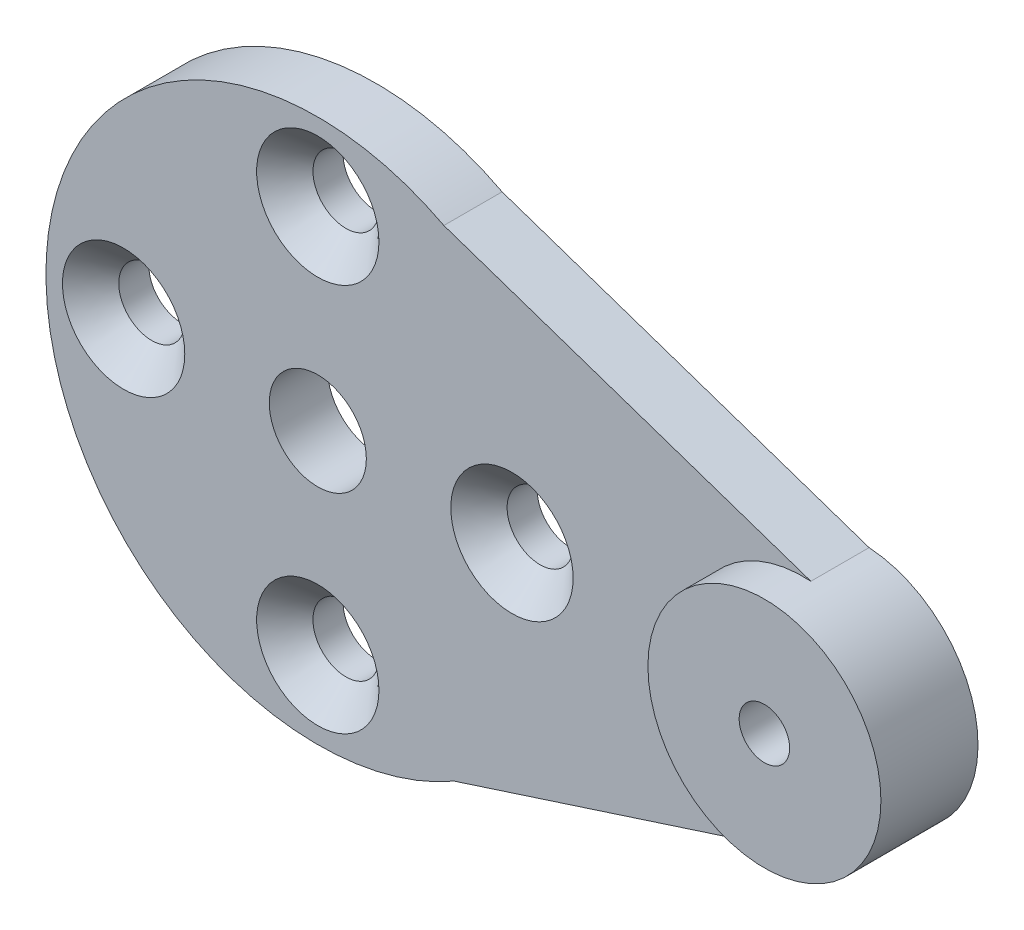
ISO-10303-21;
HEADER;
FILE_DESCRIPTION(('STEP AP214'),'2;1');
FILE_NAME('part.step','',(''),(''),'','','');
FILE_SCHEMA(('AUTOMOTIVE_DESIGN { 1 0 10303 214 1 1 1 1 }'));
ENDSEC;
DATA;
#1=APPLICATION_CONTEXT('core data for automotive mechanical design processes');
#2=APPLICATION_PROTOCOL_DEFINITION('international standard','automotive_design',2000,#1);
#3=PRODUCT_CONTEXT('',#1,'mechanical');
#4=PRODUCT('Part','Part','',(#3));
#5=PRODUCT_RELATED_PRODUCT_CATEGORY('part','',(#4));
#6=PRODUCT_DEFINITION_FORMATION('','',#4);
#7=PRODUCT_DEFINITION_CONTEXT('part definition',#1,'design');
#8=PRODUCT_DEFINITION('design','',#6,#7);
#9=PRODUCT_DEFINITION_SHAPE('','',#8);
#10=(LENGTH_UNIT() NAMED_UNIT(*) SI_UNIT(.MILLI.,.METRE.));
#11=(NAMED_UNIT(*) PLANE_ANGLE_UNIT() SI_UNIT($,.RADIAN.));
#12=(NAMED_UNIT(*) SI_UNIT($,.STERADIAN.) SOLID_ANGLE_UNIT());
#13=UNCERTAINTY_MEASURE_WITH_UNIT(LENGTH_MEASURE(1.E-05),#10,'distance_accuracy_value','');
#14=(GEOMETRIC_REPRESENTATION_CONTEXT(3) GLOBAL_UNCERTAINTY_ASSIGNED_CONTEXT((#13)) GLOBAL_UNIT_ASSIGNED_CONTEXT((#10,
#11,#12)) REPRESENTATION_CONTEXT('',''));
#15=CARTESIAN_POINT('',(0.,0.,0.));
#16=DIRECTION('',(0.,0.,1.));
#17=DIRECTION('',(1.,0.,0.));
#18=AXIS2_PLACEMENT_3D('',#15,#16,#17);
#19=CARTESIAN_POINT('',(25.,0.,3.));
#20=DIRECTION('',(0.,0.,-1.));
#21=DIRECTION('',(-1.,0.,0.));
#22=AXIS2_PLACEMENT_3D('',#19,#20,#21);
#23=CYLINDRICAL_SURFACE('',#22,6.);
#24=CARTESIAN_POINT('',(25.,0.,0.));
#25=DIRECTION('',(0.,0.,1.));
#26=DIRECTION('',(1.,0.,0.));
#27=AXIS2_PLACEMENT_3D('',#24,#25,#26);
#28=CIRCLE('',#27,6.);
#29=CARTESIAN_POINT('',(26.5781101997848,-5.78874495873979,0.));
#30=VERTEX_POINT('',#29);
#31=CARTESIAN_POINT('',(25.3934245126557,5.98708753509097,0.));
#32=VERTEX_POINT('',#31);
#33=EDGE_CURVE('E100',#30,#32,#28,.T.);
#34=ORIENTED_EDGE('',*,*,#33,.T.);
#35=DIRECTION('',(0.,0.,-1.));
#36=VECTOR('',#35,1.);
#37=CARTESIAN_POINT('',(25.3934245126557,5.98708753509097,3.));
#38=LINE('',#37,#36);
#39=CARTESIAN_POINT('',(25.3934245126557,5.98708753509097,3.));
#40=VERTEX_POINT('',#39);
#41=EDGE_CURVE('E11',#40,#32,#38,.T.);
#42=ORIENTED_EDGE('',*,*,#41,.F.);
#43=CARTESIAN_POINT('',(25.,0.,3.));
#44=DIRECTION('',(0.,0.,1.));
#45=DIRECTION('',(1.,0.,0.));
#46=AXIS2_PLACEMENT_3D('',#43,#44,#45);
#47=CIRCLE('',#46,6.);
#48=CARTESIAN_POINT('',(26.5781101997848,-5.78874495873979,3.));
#49=VERTEX_POINT('',#48);
#50=EDGE_CURVE('E98',#40,#49,#47,.T.);
#51=ORIENTED_EDGE('',*,*,#50,.T.);
#52=DIRECTION('',(0.,0.,-1.));
#53=VECTOR('',#52,1.);
#54=CARTESIAN_POINT('',(26.5781101997848,-5.78874495873979,3.));
#55=LINE('',#54,#53);
#56=EDGE_CURVE('E126',#49,#30,#55,.T.);
#57=ORIENTED_EDGE('',*,*,#56,.T.);
#58=EDGE_LOOP('',(#34,#42,#51,#57));
#59=FACE_BOUND('',#58,.T.);
#60=CARTESIAN_POINT('',(25.,0.,5.));
#61=DIRECTION('',(0.,0.,1.));
#62=DIRECTION('',(1.,0.,0.));
#63=AXIS2_PLACEMENT_3D('',#60,#61,#62);
#64=CIRCLE('',#63,6.);
#65=CARTESIAN_POINT('',(31.,0.,5.));
#66=VERTEX_POINT('',#65);
#67=EDGE_CURVE('E109',#66,#66,#64,.T.);
#68=ORIENTED_EDGE('',*,*,#67,.F.);
#69=EDGE_LOOP('',(#68));
#70=FACE_BOUND('',#69,.T.);
#71=ADVANCED_FACE('F44',(#59,#70),#23,.T.);
#72=CARTESIAN_POINT('',(6.49207546770946,12.4037476643781,3.));
#73=DIRECTION('',(-0.321462676210907,-0.946922250136368,0.));
#74=DIRECTION('',(0.946922250136368,-0.321462676210907,0.));
#75=AXIS2_PLACEMENT_3D('',#72,#73,#74);
#76=PLANE('',#75);
#77=DIRECTION('',(-0.946922250136368,0.321462676210907,0.));
#78=VECTOR('',#77,1.);
#79=CARTESIAN_POINT('',(6.49207546770946,12.4037476643781,0.));
#80=LINE('',#79,#78);
#81=CARTESIAN_POINT('',(6.49207546770946,12.4037476643781,0.));
#82=VERTEX_POINT('',#81);
#83=EDGE_CURVE('E129',#32,#82,#80,.T.);
#84=ORIENTED_EDGE('',*,*,#83,.T.);
#85=DIRECTION('',(0.,0.,-1.));
#86=VECTOR('',#85,1.);
#87=CARTESIAN_POINT('',(6.49207546770946,12.4037476643781,3.));
#88=LINE('',#87,#86);
#89=CARTESIAN_POINT('',(6.49207546770946,12.4037476643781,3.));
#90=VERTEX_POINT('',#89);
#91=EDGE_CURVE('E54',#90,#82,#88,.T.);
#92=ORIENTED_EDGE('',*,*,#91,.F.);
#93=DIRECTION('',(-0.946922250136368,0.321462676210907,0.));
#94=VECTOR('',#93,1.);
#95=CARTESIAN_POINT('',(6.49207546770946,12.4037476643781,3.));
#96=LINE('',#95,#94);
#97=EDGE_CURVE('E90',#40,#90,#96,.T.);
#98=ORIENTED_EDGE('',*,*,#97,.F.);
#99=ORIENTED_EDGE('',*,*,#41,.T.);
#100=EDGE_LOOP('',(#84,#92,#98,#99));
#101=FACE_BOUND('',#100,.T.);
#102=ADVANCED_FACE('F102',(#101),#76,.F.);
#103=CARTESIAN_POINT('',(0.,0.,3.));
#104=DIRECTION('',(0.,0.,-1.));
#105=DIRECTION('',(-1.,0.,0.));
#106=AXIS2_PLACEMENT_3D('',#103,#104,#105);
#107=CYLINDRICAL_SURFACE('',#106,14.);
#108=CARTESIAN_POINT('',(0.,0.,0.));
#109=DIRECTION('',(0.,0.,1.));
#110=DIRECTION('',(1.,0.,0.));
#111=AXIS2_PLACEMENT_3D('',#108,#109,#110);
#112=CIRCLE('',#111,14.);
#113=CARTESIAN_POINT('',(7.02294786428424,-12.1110777099127,0.));
#114=VERTEX_POINT('',#113);
#115=EDGE_CURVE('E81',#82,#114,#112,.T.);
#116=ORIENTED_EDGE('',*,*,#115,.T.);
#117=DIRECTION('',(0.,0.,-1.));
#118=VECTOR('',#117,1.);
#119=CARTESIAN_POINT('',(7.02294786428424,-12.1110777099127,3.));
#120=LINE('',#119,#118);
#121=CARTESIAN_POINT('',(7.02294786428424,-12.1110777099127,3.));
#122=VERTEX_POINT('',#121);
#123=EDGE_CURVE('E138',#122,#114,#120,.T.);
#124=ORIENTED_EDGE('',*,*,#123,.F.);
#125=CARTESIAN_POINT('',(0.,0.,3.));
#126=DIRECTION('',(0.,0.,1.));
#127=DIRECTION('',(1.,0.,0.));
#128=AXIS2_PLACEMENT_3D('',#125,#126,#127);
#129=CIRCLE('',#128,14.);
#130=EDGE_CURVE('E105',#90,#122,#129,.T.);
#131=ORIENTED_EDGE('',*,*,#130,.F.);
#132=ORIENTED_EDGE('',*,*,#91,.T.);
#133=EDGE_LOOP('',(#116,#124,#131,#132));
#134=FACE_BOUND('',#133,.T.);
#135=ADVANCED_FACE('F213',(#134),#107,.T.);
#136=CARTESIAN_POINT('',(7.02294786428424,-12.1110777099127,3.));
#137=DIRECTION('',(-0.307629228664029,0.951506309843279,0.));
#138=DIRECTION('',(-0.951506309843279,-0.307629228664029,0.));
#139=AXIS2_PLACEMENT_3D('',#136,#137,#138);
#140=PLANE('',#139);
#141=DIRECTION('',(0.951506309843279,0.307629228664029,0.));
#142=VECTOR('',#141,1.);
#143=CARTESIAN_POINT('',(7.02294786428424,-12.1110777099127,0.));
#144=LINE('',#143,#142);
#145=EDGE_CURVE('E86',#114,#30,#144,.T.);
#146=ORIENTED_EDGE('',*,*,#145,.T.);
#147=ORIENTED_EDGE('',*,*,#56,.F.);
#148=DIRECTION('',(0.951506309843279,0.307629228664029,0.));
#149=VECTOR('',#148,1.);
#150=CARTESIAN_POINT('',(7.02294786428424,-12.1110777099127,3.));
#151=LINE('',#150,#149);
#152=EDGE_CURVE('E63',#122,#49,#151,.T.);
#153=ORIENTED_EDGE('',*,*,#152,.F.);
#154=ORIENTED_EDGE('',*,*,#123,.T.);
#155=EDGE_LOOP('',(#146,#147,#153,#154));
#156=FACE_BOUND('',#155,.T.);
#157=ADVANCED_FACE('F217',(#156),#140,.F.);
#158=CARTESIAN_POINT('',(25.,0.,3.));
#159=DIRECTION('',(0.,0.,1.));
#160=DIRECTION('',(1.,0.,0.));
#161=AXIS2_PLACEMENT_3D('',#158,#159,#160);
#162=PLANE('',#161);
#163=CARTESIAN_POINT('',(0.,10.,3.));
#164=DIRECTION('',(0.,0.,1.));
#165=DIRECTION('',(1.,0.,0.));
#166=AXIS2_PLACEMENT_3D('',#163,#164,#165);
#167=CIRCLE('',#166,3.15);
#168=CARTESIAN_POINT('',(3.15,10.,3.));
#169=VERTEX_POINT('',#168);
#170=EDGE_CURVE('E273',#169,#169,#167,.T.);
#171=ORIENTED_EDGE('',*,*,#170,.F.);
#172=EDGE_LOOP('',(#171));
#173=FACE_BOUND('',#172,.T.);
#174=CARTESIAN_POINT('',(-10.,0.,3.));
#175=DIRECTION('',(0.,0.,1.));
#176=DIRECTION('',(1.,0.,0.));
#177=AXIS2_PLACEMENT_3D('',#174,#175,#176);
#178=CIRCLE('',#177,3.15);
#179=CARTESIAN_POINT('',(-6.85,0.,3.));
#180=VERTEX_POINT('',#179);
#181=EDGE_CURVE('E168',#180,#180,#178,.T.);
#182=ORIENTED_EDGE('',*,*,#181,.F.);
#183=EDGE_LOOP('',(#182));
#184=FACE_BOUND('',#183,.T.);
#185=CARTESIAN_POINT('',(0.,-10.,3.));
#186=DIRECTION('',(0.,0.,1.));
#187=DIRECTION('',(1.,0.,0.));
#188=AXIS2_PLACEMENT_3D('',#185,#186,#187);
#189=CIRCLE('',#188,3.15);
#190=CARTESIAN_POINT('',(3.15,-10.,3.));
#191=VERTEX_POINT('',#190);
#192=EDGE_CURVE('E157',#191,#191,#189,.T.);
#193=ORIENTED_EDGE('',*,*,#192,.F.);
#194=EDGE_LOOP('',(#193));
#195=FACE_BOUND('',#194,.T.);
#196=CARTESIAN_POINT('',(10.,0.,3.));
#197=DIRECTION('',(0.,0.,1.));
#198=DIRECTION('',(1.,0.,0.));
#199=AXIS2_PLACEMENT_3D('',#196,#197,#198);
#200=CIRCLE('',#199,3.15);
#201=CARTESIAN_POINT('',(13.15,0.,3.));
#202=VERTEX_POINT('',#201);
#203=EDGE_CURVE('E152',#202,#202,#200,.T.);
#204=ORIENTED_EDGE('',*,*,#203,.F.);
#205=EDGE_LOOP('',(#204));
#206=FACE_BOUND('',#205,.T.);
#207=CARTESIAN_POINT('',(0.,0.,3.));
#208=DIRECTION('',(0.,0.,1.));
#209=DIRECTION('',(1.,0.,0.));
#210=AXIS2_PLACEMENT_3D('',#207,#208,#209);
#211=CIRCLE('',#210,2.5);
#212=CARTESIAN_POINT('',(2.5,0.,3.));
#213=VERTEX_POINT('',#212);
#214=EDGE_CURVE('E147',#213,#213,#211,.T.);
#215=ORIENTED_EDGE('',*,*,#214,.F.);
#216=EDGE_LOOP('',(#215));
#217=FACE_BOUND('',#216,.T.);
#218=ORIENTED_EDGE('',*,*,#50,.F.);
#219=ORIENTED_EDGE('',*,*,#97,.T.);
#220=ORIENTED_EDGE('',*,*,#130,.T.);
#221=ORIENTED_EDGE('',*,*,#152,.T.);
#222=EDGE_LOOP('',(#218,#219,#220,#221));
#223=FACE_BOUND('',#222,.T.);
#224=ADVANCED_FACE('F107',(#173,#184,#195,#206,#217,#223),#162,.T.);
#225=CARTESIAN_POINT('',(25.,0.,0.));
#226=DIRECTION('',(0.,0.,1.));
#227=DIRECTION('',(1.,0.,0.));
#228=AXIS2_PLACEMENT_3D('',#225,#226,#227);
#229=PLANE('',#228);
#230=CARTESIAN_POINT('',(0.,10.,0.));
#231=DIRECTION('',(0.,0.,1.));
#232=DIRECTION('',(1.,0.,0.));
#233=AXIS2_PLACEMENT_3D('',#230,#231,#232);
#234=CIRCLE('',#233,1.7);
#235=CARTESIAN_POINT('',(1.7,10.,0.));
#236=VERTEX_POINT('',#235);
#237=EDGE_CURVE('E47',#236,#236,#234,.T.);
#238=ORIENTED_EDGE('',*,*,#237,.T.);
#239=EDGE_LOOP('',(#238));
#240=FACE_BOUND('',#239,.T.);
#241=CARTESIAN_POINT('',(-10.,0.,0.));
#242=DIRECTION('',(0.,0.,1.));
#243=DIRECTION('',(1.,0.,0.));
#244=AXIS2_PLACEMENT_3D('',#241,#242,#243);
#245=CIRCLE('',#244,1.7);
#246=CARTESIAN_POINT('',(-8.3,0.,0.));
#247=VERTEX_POINT('',#246);
#248=EDGE_CURVE('E154',#247,#247,#245,.T.);
#249=ORIENTED_EDGE('',*,*,#248,.T.);
#250=EDGE_LOOP('',(#249));
#251=FACE_BOUND('',#250,.T.);
#252=CARTESIAN_POINT('',(0.,-10.,0.));
#253=DIRECTION('',(0.,0.,1.));
#254=DIRECTION('',(1.,0.,0.));
#255=AXIS2_PLACEMENT_3D('',#252,#253,#254);
#256=CIRCLE('',#255,1.7);
#257=CARTESIAN_POINT('',(1.7,-10.,0.));
#258=VERTEX_POINT('',#257);
#259=EDGE_CURVE('E149',#258,#258,#256,.T.);
#260=ORIENTED_EDGE('',*,*,#259,.T.);
#261=EDGE_LOOP('',(#260));
#262=FACE_BOUND('',#261,.T.);
#263=CARTESIAN_POINT('',(10.,0.,0.));
#264=DIRECTION('',(0.,0.,1.));
#265=DIRECTION('',(1.,0.,0.));
#266=AXIS2_PLACEMENT_3D('',#263,#264,#265);
#267=CIRCLE('',#266,1.7);
#268=CARTESIAN_POINT('',(11.7,0.,0.));
#269=VERTEX_POINT('',#268);
#270=EDGE_CURVE('E143',#269,#269,#267,.T.);
#271=ORIENTED_EDGE('',*,*,#270,.T.);
#272=EDGE_LOOP('',(#271));
#273=FACE_BOUND('',#272,.T.);
#274=CARTESIAN_POINT('',(0.,0.,0.));
#275=DIRECTION('',(0.,0.,1.));
#276=DIRECTION('',(1.,0.,0.));
#277=AXIS2_PLACEMENT_3D('',#274,#275,#276);
#278=CIRCLE('',#277,2.5);
#279=CARTESIAN_POINT('',(2.5,0.,0.));
#280=VERTEX_POINT('',#279);
#281=EDGE_CURVE('E188',#280,#280,#278,.T.);
#282=ORIENTED_EDGE('',*,*,#281,.T.);
#283=EDGE_LOOP('',(#282));
#284=FACE_BOUND('',#283,.T.);
#285=CARTESIAN_POINT('',(25.,0.,0.));
#286=DIRECTION('',(0.,0.,1.));
#287=DIRECTION('',(1.,0.,0.));
#288=AXIS2_PLACEMENT_3D('',#285,#286,#287);
#289=CIRCLE('',#288,1.3);
#290=CARTESIAN_POINT('',(26.3,0.,0.));
#291=VERTEX_POINT('',#290);
#292=EDGE_CURVE('E110',#291,#291,#289,.T.);
#293=ORIENTED_EDGE('',*,*,#292,.T.);
#294=EDGE_LOOP('',(#293));
#295=FACE_BOUND('',#294,.T.);
#296=ORIENTED_EDGE('',*,*,#33,.F.);
#297=ORIENTED_EDGE('',*,*,#145,.F.);
#298=ORIENTED_EDGE('',*,*,#115,.F.);
#299=ORIENTED_EDGE('',*,*,#83,.F.);
#300=EDGE_LOOP('',(#296,#297,#298,#299));
#301=FACE_BOUND('',#300,.T.);
#302=ADVANCED_FACE('F206',(#240,#251,#262,#273,#284,#295,#301),#229,.F.);
#303=CARTESIAN_POINT('',(25.,0.,5.));
#304=DIRECTION('',(0.,0.,1.));
#305=DIRECTION('',(1.,0.,0.));
#306=AXIS2_PLACEMENT_3D('',#303,#304,#305);
#307=PLANE('',#306);
#308=CARTESIAN_POINT('',(25.,0.,5.));
#309=DIRECTION('',(0.,0.,1.));
#310=DIRECTION('',(1.,0.,0.));
#311=AXIS2_PLACEMENT_3D('',#308,#309,#310);
#312=CIRCLE('',#311,1.3);
#313=CARTESIAN_POINT('',(26.3,0.,5.));
#314=VERTEX_POINT('',#313);
#315=EDGE_CURVE('E119',#314,#314,#312,.T.);
#316=ORIENTED_EDGE('',*,*,#315,.F.);
#317=EDGE_LOOP('',(#316));
#318=FACE_BOUND('',#317,.T.);
#319=ORIENTED_EDGE('',*,*,#67,.T.);
#320=EDGE_LOOP('',(#319));
#321=FACE_BOUND('',#320,.T.);
#322=ADVANCED_FACE('F203',(#318,#321),#307,.T.);
#323=CARTESIAN_POINT('',(25.,0.,5.));
#324=DIRECTION('',(0.,0.,1.));
#325=DIRECTION('',(1.,0.,0.));
#326=AXIS2_PLACEMENT_3D('',#323,#324,#325);
#327=CYLINDRICAL_SURFACE('',#326,1.3);
#328=ORIENTED_EDGE('',*,*,#292,.F.);
#329=EDGE_LOOP('',(#328));
#330=FACE_BOUND('',#329,.T.);
#331=ORIENTED_EDGE('',*,*,#315,.T.);
#332=EDGE_LOOP('',(#331));
#333=FACE_BOUND('',#332,.T.);
#334=ADVANCED_FACE('F201',(#330,#333),#327,.F.);
#335=CARTESIAN_POINT('',(0.,0.,0.));
#336=DIRECTION('',(0.,0.,1.));
#337=DIRECTION('',(1.,0.,0.));
#338=AXIS2_PLACEMENT_3D('',#335,#336,#337);
#339=CYLINDRICAL_SURFACE('',#338,2.5);
#340=ORIENTED_EDGE('',*,*,#281,.F.);
#341=EDGE_LOOP('',(#340));
#342=FACE_BOUND('',#341,.T.);
#343=ORIENTED_EDGE('',*,*,#214,.T.);
#344=EDGE_LOOP('',(#343));
#345=FACE_BOUND('',#344,.T.);
#346=ADVANCED_FACE('F230',(#342,#345),#339,.F.);
#347=CARTESIAN_POINT('',(10.,0.,3.));
#348=DIRECTION('',(0.,0.,1.));
#349=DIRECTION('',(1.,0.,0.));
#350=AXIS2_PLACEMENT_3D('',#347,#348,#349);
#351=CYLINDRICAL_SURFACE('',#350,1.7);
#352=CARTESIAN_POINT('',(10.,0.,1.55));
#353=DIRECTION('',(0.,0.,1.));
#354=DIRECTION('',(1.,0.,0.));
#355=AXIS2_PLACEMENT_3D('',#352,#353,#354);
#356=CIRCLE('',#355,1.7);
#357=CARTESIAN_POINT('',(11.7,0.,1.55));
#358=VERTEX_POINT('',#357);
#359=EDGE_CURVE('E148',#358,#358,#356,.T.);
#360=ORIENTED_EDGE('',*,*,#359,.T.);
#361=EDGE_LOOP('',(#360));
#362=FACE_BOUND('',#361,.T.);
#363=ORIENTED_EDGE('',*,*,#270,.F.);
#364=EDGE_LOOP('',(#363));
#365=FACE_BOUND('',#364,.T.);
#366=ADVANCED_FACE('F234',(#362,#365),#351,.F.);
#367=CARTESIAN_POINT('',(10.,0.,3.));
#368=DIRECTION('',(0.,0.,1.));
#369=DIRECTION('',(1.,0.,0.));
#370=AXIS2_PLACEMENT_3D('',#367,#368,#369);
#371=CONICAL_SURFACE('',#370,3.15,0.785398163397447);
#372=ORIENTED_EDGE('',*,*,#359,.F.);
#373=EDGE_LOOP('',(#372));
#374=FACE_BOUND('',#373,.T.);
#375=ORIENTED_EDGE('',*,*,#203,.T.);
#376=EDGE_LOOP('',(#375));
#377=FACE_BOUND('',#376,.T.);
#378=ADVANCED_FACE('F238',(#374,#377),#371,.F.);
#379=CARTESIAN_POINT('',(0.,-10.,3.));
#380=DIRECTION('',(0.,0.,1.));
#381=DIRECTION('',(1.,0.,0.));
#382=AXIS2_PLACEMENT_3D('',#379,#380,#381);
#383=CYLINDRICAL_SURFACE('',#382,1.7);
#384=CARTESIAN_POINT('',(0.,-10.,1.55));
#385=DIRECTION('',(0.,0.,1.));
#386=DIRECTION('',(1.,0.,0.));
#387=AXIS2_PLACEMENT_3D('',#384,#385,#386);
#388=CIRCLE('',#387,1.7);
#389=CARTESIAN_POINT('',(1.7,-10.,1.55));
#390=VERTEX_POINT('',#389);
#391=EDGE_CURVE('E153',#390,#390,#388,.T.);
#392=ORIENTED_EDGE('',*,*,#391,.T.);
#393=EDGE_LOOP('',(#392));
#394=FACE_BOUND('',#393,.T.);
#395=ORIENTED_EDGE('',*,*,#259,.F.);
#396=EDGE_LOOP('',(#395));
#397=FACE_BOUND('',#396,.T.);
#398=ADVANCED_FACE('F242',(#394,#397),#383,.F.);
#399=CARTESIAN_POINT('',(0.,-10.,3.));
#400=DIRECTION('',(0.,0.,1.));
#401=DIRECTION('',(1.,0.,0.));
#402=AXIS2_PLACEMENT_3D('',#399,#400,#401);
#403=CONICAL_SURFACE('',#402,3.15,0.785398163397447);
#404=ORIENTED_EDGE('',*,*,#391,.F.);
#405=EDGE_LOOP('',(#404));
#406=FACE_BOUND('',#405,.T.);
#407=ORIENTED_EDGE('',*,*,#192,.T.);
#408=EDGE_LOOP('',(#407));
#409=FACE_BOUND('',#408,.T.);
#410=ADVANCED_FACE('F246',(#406,#409),#403,.F.);
#411=CARTESIAN_POINT('',(-10.,0.,3.));
#412=DIRECTION('',(0.,0.,1.));
#413=DIRECTION('',(1.,0.,0.));
#414=AXIS2_PLACEMENT_3D('',#411,#412,#413);
#415=CYLINDRICAL_SURFACE('',#414,1.7);
#416=CARTESIAN_POINT('',(-10.,0.,1.55));
#417=DIRECTION('',(0.,0.,1.));
#418=DIRECTION('',(1.,0.,0.));
#419=AXIS2_PLACEMENT_3D('',#416,#417,#418);
#420=CIRCLE('',#419,1.7);
#421=CARTESIAN_POINT('',(-8.3,0.,1.55));
#422=VERTEX_POINT('',#421);
#423=EDGE_CURVE('E158',#422,#422,#420,.T.);
#424=ORIENTED_EDGE('',*,*,#423,.T.);
#425=EDGE_LOOP('',(#424));
#426=FACE_BOUND('',#425,.T.);
#427=ORIENTED_EDGE('',*,*,#248,.F.);
#428=EDGE_LOOP('',(#427));
#429=FACE_BOUND('',#428,.T.);
#430=ADVANCED_FACE('F250',(#426,#429),#415,.F.);
#431=CARTESIAN_POINT('',(-10.,0.,3.));
#432=DIRECTION('',(0.,0.,1.));
#433=DIRECTION('',(1.,0.,0.));
#434=AXIS2_PLACEMENT_3D('',#431,#432,#433);
#435=CONICAL_SURFACE('',#434,3.15,0.785398163397447);
#436=ORIENTED_EDGE('',*,*,#423,.F.);
#437=EDGE_LOOP('',(#436));
#438=FACE_BOUND('',#437,.T.);
#439=ORIENTED_EDGE('',*,*,#181,.T.);
#440=EDGE_LOOP('',(#439));
#441=FACE_BOUND('',#440,.T.);
#442=ADVANCED_FACE('F254',(#438,#441),#435,.F.);
#443=CARTESIAN_POINT('',(0.,10.,3.));
#444=DIRECTION('',(0.,0.,1.));
#445=DIRECTION('',(1.,0.,0.));
#446=AXIS2_PLACEMENT_3D('',#443,#444,#445);
#447=CYLINDRICAL_SURFACE('',#446,1.7);
#448=CARTESIAN_POINT('',(0.,10.,1.55));
#449=DIRECTION('',(0.,0.,1.));
#450=DIRECTION('',(1.,0.,0.));
#451=AXIS2_PLACEMENT_3D('',#448,#449,#450);
#452=CIRCLE('',#451,1.7);
#453=CARTESIAN_POINT('',(1.7,10.,1.55));
#454=VERTEX_POINT('',#453);
#455=EDGE_CURVE('E270',#454,#454,#452,.T.);
#456=ORIENTED_EDGE('',*,*,#455,.T.);
#457=EDGE_LOOP('',(#456));
#458=FACE_BOUND('',#457,.T.);
#459=ORIENTED_EDGE('',*,*,#237,.F.);
#460=EDGE_LOOP('',(#459));
#461=FACE_BOUND('',#460,.T.);
#462=ADVANCED_FACE('F257',(#458,#461),#447,.F.);
#463=CARTESIAN_POINT('',(0.,10.,3.));
#464=DIRECTION('',(0.,0.,1.));
#465=DIRECTION('',(1.,0.,0.));
#466=AXIS2_PLACEMENT_3D('',#463,#464,#465);
#467=CONICAL_SURFACE('',#466,3.15,0.785398163397447);
#468=ORIENTED_EDGE('',*,*,#455,.F.);
#469=EDGE_LOOP('',(#468));
#470=FACE_BOUND('',#469,.T.);
#471=ORIENTED_EDGE('',*,*,#170,.T.);
#472=EDGE_LOOP('',(#471));
#473=FACE_BOUND('',#472,.T.);
#474=ADVANCED_FACE('F261',(#470,#473),#467,.F.);
#475=CLOSED_SHELL('',(#71,#102,#135,#157,#224,#302,#322,#334,#346,#366,#378,#398,#410,#430,#442,
#462,#474));
#476=MANIFOLD_SOLID_BREP('B2',#475);
#477=ADVANCED_BREP_SHAPE_REPRESENTATION('',(#18,#476),#14);
#478=SHAPE_DEFINITION_REPRESENTATION(#9,#477);
ENDSEC;
END-ISO-10303-21;
